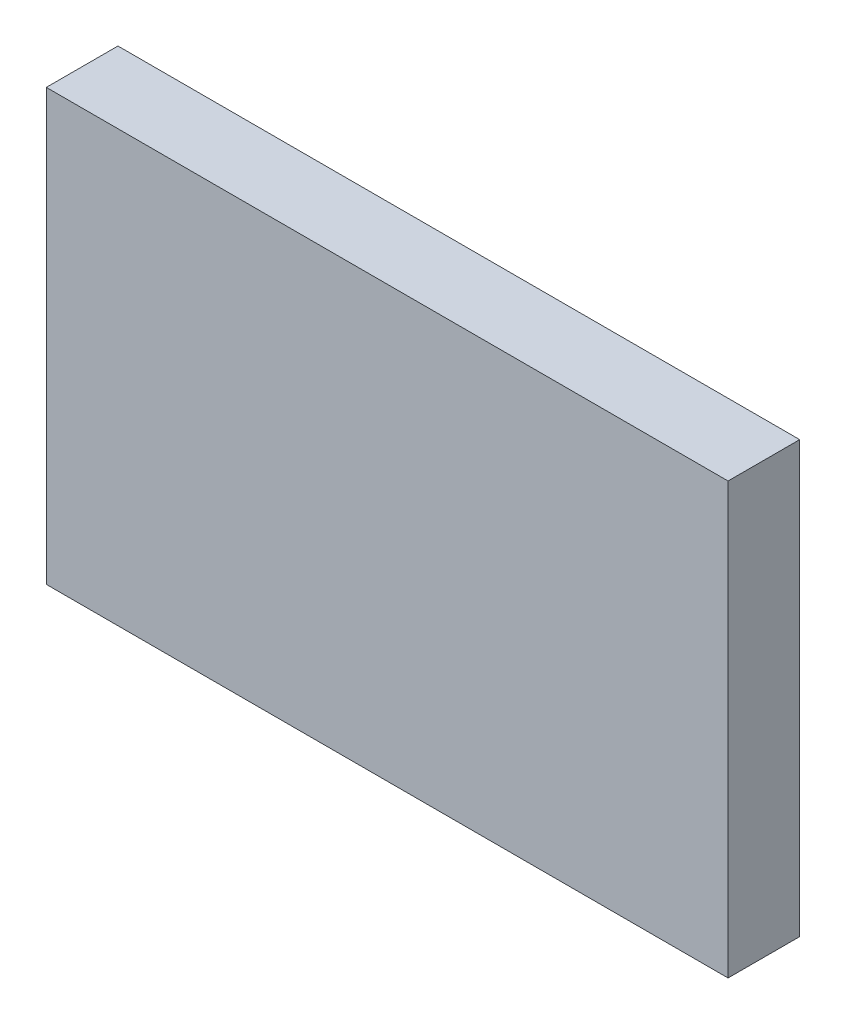
ISO-10303-21;
HEADER;
FILE_DESCRIPTION(('STEP AP214'),'2;1');
FILE_NAME('part.step','',(''),(''),'','','');
FILE_SCHEMA(('AUTOMOTIVE_DESIGN { 1 0 10303 214 1 1 1 1 }'));
ENDSEC;
DATA;
#1=APPLICATION_CONTEXT('core data for automotive mechanical design processes');
#2=APPLICATION_PROTOCOL_DEFINITION('international standard','automotive_design',2000,#1);
#3=PRODUCT_CONTEXT('',#1,'mechanical');
#4=PRODUCT('Part','Part','',(#3));
#5=PRODUCT_RELATED_PRODUCT_CATEGORY('part','',(#4));
#6=PRODUCT_DEFINITION_FORMATION('','',#4);
#7=PRODUCT_DEFINITION_CONTEXT('part definition',#1,'design');
#8=PRODUCT_DEFINITION('design','',#6,#7);
#9=PRODUCT_DEFINITION_SHAPE('','',#8);
#10=(LENGTH_UNIT() NAMED_UNIT(*) SI_UNIT(.MILLI.,.METRE.));
#11=(NAMED_UNIT(*) PLANE_ANGLE_UNIT() SI_UNIT($,.RADIAN.));
#12=(NAMED_UNIT(*) SI_UNIT($,.STERADIAN.) SOLID_ANGLE_UNIT());
#13=UNCERTAINTY_MEASURE_WITH_UNIT(LENGTH_MEASURE(1.E-05),#10,'distance_accuracy_value','');
#14=(GEOMETRIC_REPRESENTATION_CONTEXT(3) GLOBAL_UNCERTAINTY_ASSIGNED_CONTEXT((#13)) GLOBAL_UNIT_ASSIGNED_CONTEXT((#10,
#11,#12)) REPRESENTATION_CONTEXT('',''));
#15=CARTESIAN_POINT('',(0.,0.,0.));
#16=DIRECTION('',(0.,0.,1.));
#17=DIRECTION('',(1.,0.,0.));
#18=AXIS2_PLACEMENT_3D('',#15,#16,#17);
#19=CARTESIAN_POINT('',(4.758,0.,0.5));
#20=DIRECTION('',(-1.,0.,0.));
#21=DIRECTION('',(0.,0.,1.));
#22=AXIS2_PLACEMENT_3D('',#19,#20,#21);
#23=PLANE('',#22);
#24=DIRECTION('',(0.,0.,-1.));
#25=VECTOR('',#24,1.);
#26=CARTESIAN_POINT('',(4.758,-3.004,0.5));
#27=LINE('',#26,#25);
#28=CARTESIAN_POINT('',(4.758,-3.004,1.));
#29=VERTEX_POINT('',#28);
#30=CARTESIAN_POINT('',(4.758,-3.004,0.));
#31=VERTEX_POINT('',#30);
#32=EDGE_CURVE('E104',#29,#31,#27,.T.);
#33=ORIENTED_EDGE('',*,*,#32,.T.);
#34=DIRECTION('',(0.,-1.,0.));
#35=VECTOR('',#34,1.);
#36=CARTESIAN_POINT('',(4.758,0.,0.));
#37=LINE('',#36,#35);
#38=CARTESIAN_POINT('',(4.758,3.004,0.));
#39=VERTEX_POINT('',#38);
#40=EDGE_CURVE('E79',#39,#31,#37,.T.);
#41=ORIENTED_EDGE('',*,*,#40,.F.);
#42=DIRECTION('',(0.,0.,-1.));
#43=VECTOR('',#42,1.);
#44=CARTESIAN_POINT('',(4.758,3.004,0.5));
#45=LINE('',#44,#43);
#46=CARTESIAN_POINT('',(4.758,3.004,1.));
#47=VERTEX_POINT('',#46);
#48=EDGE_CURVE('E11',#47,#39,#45,.T.);
#49=ORIENTED_EDGE('',*,*,#48,.F.);
#50=DIRECTION('',(0.,1.,0.));
#51=VECTOR('',#50,1.);
#52=CARTESIAN_POINT('',(4.758,0.,1.));
#53=LINE('',#52,#51);
#54=EDGE_CURVE('E77',#29,#47,#53,.T.);
#55=ORIENTED_EDGE('',*,*,#54,.F.);
#56=EDGE_LOOP('',(#33,#41,#49,#55));
#57=FACE_BOUND('',#56,.T.);
#58=ADVANCED_FACE('F17',(#57),#23,.F.);
#59=CARTESIAN_POINT('',(0.,3.004,0.5));
#60=DIRECTION('',(0.,-1.,0.));
#61=DIRECTION('',(0.,0.,-1.));
#62=AXIS2_PLACEMENT_3D('',#59,#60,#61);
#63=PLANE('',#62);
#64=ORIENTED_EDGE('',*,*,#48,.T.);
#65=DIRECTION('',(1.,0.,0.));
#66=VECTOR('',#65,1.);
#67=CARTESIAN_POINT('',(0.,3.004,0.));
#68=LINE('',#67,#66);
#69=CARTESIAN_POINT('',(-4.758,3.004,0.));
#70=VERTEX_POINT('',#69);
#71=EDGE_CURVE('E98',#70,#39,#68,.T.);
#72=ORIENTED_EDGE('',*,*,#71,.F.);
#73=DIRECTION('',(0.,0.,-1.));
#74=VECTOR('',#73,1.);
#75=CARTESIAN_POINT('',(-4.758,3.004,0.5));
#76=LINE('',#75,#74);
#77=CARTESIAN_POINT('',(-4.758,3.004,1.));
#78=VERTEX_POINT('',#77);
#79=EDGE_CURVE('E26',#78,#70,#76,.T.);
#80=ORIENTED_EDGE('',*,*,#79,.F.);
#81=DIRECTION('',(-1.,0.,0.));
#82=VECTOR('',#81,1.);
#83=CARTESIAN_POINT('',(0.,3.004,1.));
#84=LINE('',#83,#82);
#85=EDGE_CURVE('E81',#47,#78,#84,.T.);
#86=ORIENTED_EDGE('',*,*,#85,.F.);
#87=EDGE_LOOP('',(#64,#72,#80,#86));
#88=FACE_BOUND('',#87,.T.);
#89=ADVANCED_FACE('F82',(#88),#63,.F.);
#90=CARTESIAN_POINT('',(-4.758,0.,0.5));
#91=DIRECTION('',(1.,0.,0.));
#92=DIRECTION('',(0.,1.,0.));
#93=AXIS2_PLACEMENT_3D('',#90,#91,#92);
#94=PLANE('',#93);
#95=ORIENTED_EDGE('',*,*,#79,.T.);
#96=DIRECTION('',(0.,1.,0.));
#97=VECTOR('',#96,1.);
#98=CARTESIAN_POINT('',(-4.758,0.,0.));
#99=LINE('',#98,#97);
#100=CARTESIAN_POINT('',(-4.758,-3.004,0.));
#101=VERTEX_POINT('',#100);
#102=EDGE_CURVE('E101',#101,#70,#99,.T.);
#103=ORIENTED_EDGE('',*,*,#102,.F.);
#104=DIRECTION('',(0.,0.,-1.));
#105=VECTOR('',#104,1.);
#106=CARTESIAN_POINT('',(-4.758,-3.004,0.5));
#107=LINE('',#106,#105);
#108=CARTESIAN_POINT('',(-4.758,-3.004,1.));
#109=VERTEX_POINT('',#108);
#110=EDGE_CURVE('E20',#109,#101,#107,.T.);
#111=ORIENTED_EDGE('',*,*,#110,.F.);
#112=DIRECTION('',(0.,-1.,0.));
#113=VECTOR('',#112,1.);
#114=CARTESIAN_POINT('',(-4.758,0.,1.));
#115=LINE('',#114,#113);
#116=EDGE_CURVE('E86',#78,#109,#115,.T.);
#117=ORIENTED_EDGE('',*,*,#116,.F.);
#118=EDGE_LOOP('',(#95,#103,#111,#117));
#119=FACE_BOUND('',#118,.T.);
#120=ADVANCED_FACE('F124',(#119),#94,.F.);
#121=CARTESIAN_POINT('',(0.,-3.004,0.5));
#122=DIRECTION('',(0.,1.,0.));
#123=DIRECTION('',(1.,0.,0.));
#124=AXIS2_PLACEMENT_3D('',#121,#122,#123);
#125=PLANE('',#124);
#126=ORIENTED_EDGE('',*,*,#110,.T.);
#127=DIRECTION('',(-1.,0.,0.));
#128=VECTOR('',#127,1.);
#129=CARTESIAN_POINT('',(0.,-3.004,0.));
#130=LINE('',#129,#128);
#131=EDGE_CURVE('E109',#31,#101,#130,.T.);
#132=ORIENTED_EDGE('',*,*,#131,.F.);
#133=ORIENTED_EDGE('',*,*,#32,.F.);
#134=DIRECTION('',(1.,0.,0.));
#135=VECTOR('',#134,1.);
#136=CARTESIAN_POINT('',(0.,-3.004,1.));
#137=LINE('',#136,#135);
#138=EDGE_CURVE('E90',#109,#29,#137,.T.);
#139=ORIENTED_EDGE('',*,*,#138,.F.);
#140=EDGE_LOOP('',(#126,#132,#133,#139));
#141=FACE_BOUND('',#140,.T.);
#142=ADVANCED_FACE('F126',(#141),#125,.F.);
#143=CARTESIAN_POINT('',(0.,0.,0.));
#144=DIRECTION('',(0.,0.,1.));
#145=DIRECTION('',(1.,0.,0.));
#146=AXIS2_PLACEMENT_3D('',#143,#144,#145);
#147=PLANE('',#146);
#148=ORIENTED_EDGE('',*,*,#40,.T.);
#149=ORIENTED_EDGE('',*,*,#131,.T.);
#150=ORIENTED_EDGE('',*,*,#102,.T.);
#151=ORIENTED_EDGE('',*,*,#71,.T.);
#152=EDGE_LOOP('',(#148,#149,#150,#151));
#153=FACE_BOUND('',#152,.T.);
#154=ADVANCED_FACE('F123',(#153),#147,.F.);
#155=CARTESIAN_POINT('',(0.,0.,1.));
#156=DIRECTION('',(0.,0.,1.));
#157=DIRECTION('',(1.,0.,0.));
#158=AXIS2_PLACEMENT_3D('',#155,#156,#157);
#159=PLANE('',#158);
#160=ORIENTED_EDGE('',*,*,#54,.T.);
#161=ORIENTED_EDGE('',*,*,#85,.T.);
#162=ORIENTED_EDGE('',*,*,#116,.T.);
#163=ORIENTED_EDGE('',*,*,#138,.T.);
#164=EDGE_LOOP('',(#160,#161,#162,#163));
#165=FACE_BOUND('',#164,.T.);
#166=ADVANCED_FACE('F89',(#165),#159,.T.);
#167=CLOSED_SHELL('',(#58,#89,#120,#142,#154,#166));
#168=MANIFOLD_SOLID_BREP('B1',#167);
#169=ADVANCED_BREP_SHAPE_REPRESENTATION('',(#18,#168),#14);
#170=SHAPE_DEFINITION_REPRESENTATION(#9,#169);
ENDSEC;
END-ISO-10303-21;
